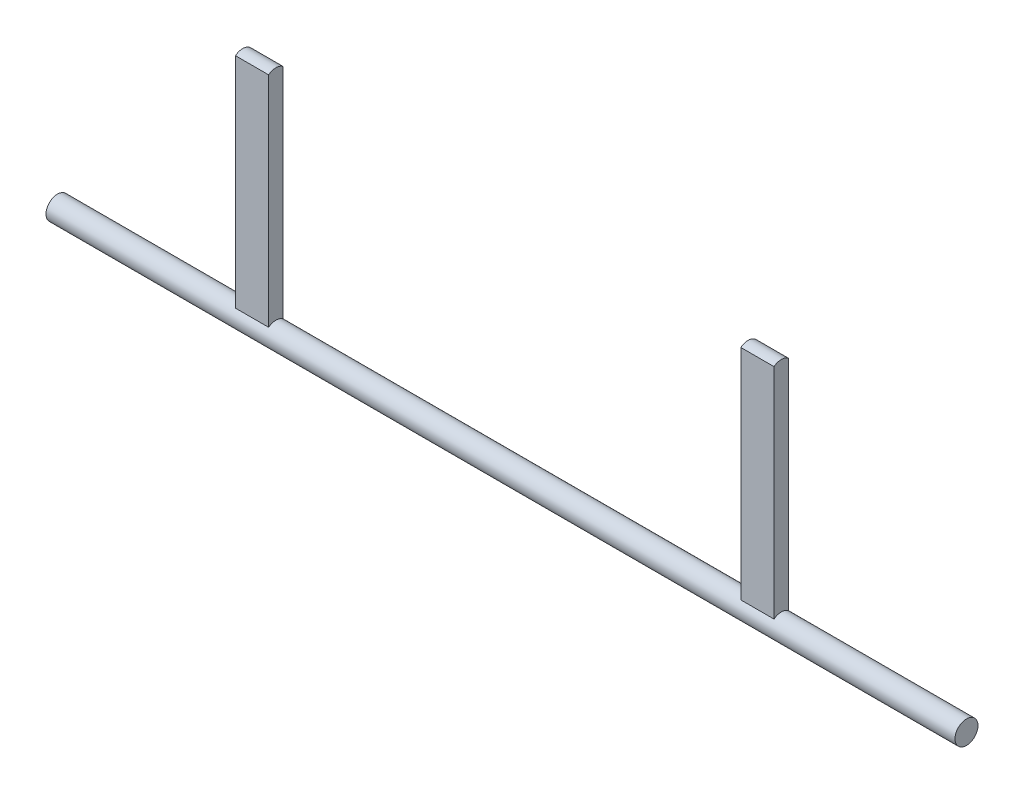
ISO-10303-21;
HEADER;
FILE_DESCRIPTION(('STEP AP214'),'2;1');
FILE_NAME('part.step','',(''),(''),'','','');
FILE_SCHEMA(('AUTOMOTIVE_DESIGN { 1 0 10303 214 1 1 1 1 }'));
ENDSEC;
DATA;
#1=APPLICATION_CONTEXT('core data for automotive mechanical design processes');
#2=APPLICATION_PROTOCOL_DEFINITION('international standard','automotive_design',2000,#1);
#3=PRODUCT_CONTEXT('',#1,'mechanical');
#4=PRODUCT('Part','Part','',(#3));
#5=PRODUCT_RELATED_PRODUCT_CATEGORY('part','',(#4));
#6=PRODUCT_DEFINITION_FORMATION('','',#4);
#7=PRODUCT_DEFINITION_CONTEXT('part definition',#1,'design');
#8=PRODUCT_DEFINITION('design','',#6,#7);
#9=PRODUCT_DEFINITION_SHAPE('','',#8);
#10=(LENGTH_UNIT() NAMED_UNIT(*) SI_UNIT(.MILLI.,.METRE.));
#11=(NAMED_UNIT(*) PLANE_ANGLE_UNIT() SI_UNIT($,.RADIAN.));
#12=(NAMED_UNIT(*) SI_UNIT($,.STERADIAN.) SOLID_ANGLE_UNIT());
#13=UNCERTAINTY_MEASURE_WITH_UNIT(LENGTH_MEASURE(1.E-05),#10,'distance_accuracy_value','');
#14=(GEOMETRIC_REPRESENTATION_CONTEXT(3) GLOBAL_UNCERTAINTY_ASSIGNED_CONTEXT((#13)) GLOBAL_UNIT_ASSIGNED_CONTEXT((#10,
#11,#12)) REPRESENTATION_CONTEXT('',''));
#15=CARTESIAN_POINT('',(0.,0.,0.));
#16=DIRECTION('',(0.,0.,1.));
#17=DIRECTION('',(1.,0.,0.));
#18=AXIS2_PLACEMENT_3D('',#15,#16,#17);
#19=CARTESIAN_POINT('',(270.121951219512,0.,0.));
#20=DIRECTION('',(1.,0.,0.));
#21=DIRECTION('',(0.,0.,-1.));
#22=AXIS2_PLACEMENT_3D('',#19,#20,#21);
#23=CYLINDRICAL_SURFACE('',#22,18.75);
#24=CARTESIAN_POINT('',(-740.,0.,0.));
#25=DIRECTION('',(1.,0.,0.));
#26=DIRECTION('',(0.,0.,-1.));
#27=AXIS2_PLACEMENT_3D('',#24,#25,#26);
#28=CIRCLE('',#27,18.75);
#29=CARTESIAN_POINT('',(-740.,0.,-18.75));
#30=VERTEX_POINT('',#29);
#31=EDGE_CURVE('E11',#30,#30,#28,.T.);
#32=ORIENTED_EDGE('',*,*,#31,.T.);
#33=EDGE_LOOP('',(#32));
#34=FACE_BOUND('',#33,.T.);
#35=CARTESIAN_POINT('',(740.,0.,0.));
#36=DIRECTION('',(1.,0.,0.));
#37=DIRECTION('',(0.,0.,-1.));
#38=AXIS2_PLACEMENT_3D('',#35,#36,#37);
#39=CIRCLE('',#38,18.75);
#40=CARTESIAN_POINT('',(740.,0.,-18.75));
#41=VERTEX_POINT('',#40);
#42=EDGE_CURVE('E43',#41,#41,#39,.T.);
#43=ORIENTED_EDGE('',*,*,#42,.F.);
#44=EDGE_LOOP('',(#43));
#45=FACE_BOUND('',#44,.T.);
#46=CARTESIAN_POINT('',(-438.446590398755,0.,0.));
#47=DIRECTION('',(1.,0.,0.));
#48=DIRECTION('',(0.,0.,-1.));
#49=AXIS2_PLACEMENT_3D('',#46,#47,#48);
#50=CIRCLE('',#49,18.75);
#51=CARTESIAN_POINT('',(-438.446590398755,14.5730438193042,-11.7978342860306));
#52=VERTEX_POINT('',#51);
#53=CARTESIAN_POINT('',(-438.446590398755,14.5730438193042,11.7978342860306));
#54=VERTEX_POINT('',#53);
#55=EDGE_CURVE('E125',#52,#54,#50,.T.);
#56=ORIENTED_EDGE('',*,*,#55,.F.);
#57=DIRECTION('',(1.,0.,0.));
#58=VECTOR('',#57,1.);
#59=CARTESIAN_POINT('',(270.121951219512,14.5730438193042,-11.7978342860306));
#60=LINE('',#59,#58);
#61=CARTESIAN_POINT('',(-384.42466696444,14.5730438193042,-11.7978342860306));
#62=VERTEX_POINT('',#61);
#63=EDGE_CURVE('E138',#52,#62,#60,.T.);
#64=ORIENTED_EDGE('',*,*,#63,.T.);
#65=CARTESIAN_POINT('',(-384.42466696444,0.,0.));
#66=DIRECTION('',(-1.,0.,0.));
#67=DIRECTION('',(0.,0.,1.));
#68=AXIS2_PLACEMENT_3D('',#65,#66,#67);
#69=CIRCLE('',#68,18.75);
#70=CARTESIAN_POINT('',(-384.42466696444,14.5730438193042,11.7978342860306));
#71=VERTEX_POINT('',#70);
#72=EDGE_CURVE('E133',#71,#62,#69,.T.);
#73=ORIENTED_EDGE('',*,*,#72,.F.);
#74=DIRECTION('',(1.,0.,0.));
#75=VECTOR('',#74,1.);
#76=CARTESIAN_POINT('',(270.121951219512,14.5730438193042,11.7978342860306));
#77=LINE('',#76,#75);
#78=EDGE_CURVE('E129',#54,#71,#77,.T.);
#79=ORIENTED_EDGE('',*,*,#78,.F.);
#80=EDGE_LOOP('',(#56,#64,#73,#79));
#81=FACE_BOUND('',#80,.T.);
#82=CARTESIAN_POINT('',(384.42466696444,0.,0.));
#83=DIRECTION('',(-1.,0.,0.));
#84=DIRECTION('',(0.,0.,1.));
#85=AXIS2_PLACEMENT_3D('',#82,#83,#84);
#86=CIRCLE('',#85,18.75);
#87=CARTESIAN_POINT('',(384.42466696444,14.5730438193042,11.7978342860306));
#88=VERTEX_POINT('',#87);
#89=CARTESIAN_POINT('',(384.42466696444,14.5730438193042,-11.7978342860306));
#90=VERTEX_POINT('',#89);
#91=EDGE_CURVE('E50',#88,#90,#86,.T.);
#92=ORIENTED_EDGE('',*,*,#91,.T.);
#93=DIRECTION('',(1.,0.,0.));
#94=VECTOR('',#93,1.);
#95=CARTESIAN_POINT('',(270.121951219512,14.5730438193042,-11.7978342860306));
#96=LINE('',#95,#94);
#97=CARTESIAN_POINT('',(438.446590398755,14.5730438193042,-11.7978342860306));
#98=VERTEX_POINT('',#97);
#99=EDGE_CURVE('E54',#90,#98,#96,.T.);
#100=ORIENTED_EDGE('',*,*,#99,.T.);
#101=CARTESIAN_POINT('',(438.446590398755,0.,0.));
#102=DIRECTION('',(1.,0.,0.));
#103=DIRECTION('',(0.,0.,-1.));
#104=AXIS2_PLACEMENT_3D('',#101,#102,#103);
#105=CIRCLE('',#104,18.75);
#106=CARTESIAN_POINT('',(438.446590398755,14.5730438193042,11.7978342860306));
#107=VERTEX_POINT('',#106);
#108=EDGE_CURVE('E95',#98,#107,#105,.T.);
#109=ORIENTED_EDGE('',*,*,#108,.T.);
#110=DIRECTION('',(1.,0.,0.));
#111=VECTOR('',#110,1.);
#112=CARTESIAN_POINT('',(270.121951219512,14.5730438193042,11.7978342860306));
#113=LINE('',#112,#111);
#114=EDGE_CURVE('E97',#88,#107,#113,.T.);
#115=ORIENTED_EDGE('',*,*,#114,.F.);
#116=EDGE_LOOP('',(#92,#100,#109,#115));
#117=FACE_BOUND('',#116,.T.);
#118=ADVANCED_FACE('F35',(#34,#45,#81,#117),#23,.T.);
#119=CARTESIAN_POINT('',(-740.,0.,0.));
#120=DIRECTION('',(-1.,0.,0.));
#121=DIRECTION('',(0.,0.,1.));
#122=AXIS2_PLACEMENT_3D('',#119,#120,#121);
#123=PLANE('',#122);
#124=ORIENTED_EDGE('',*,*,#31,.F.);
#125=EDGE_LOOP('',(#124));
#126=FACE_BOUND('',#125,.T.);
#127=ADVANCED_FACE('F37',(#126),#123,.T.);
#128=CARTESIAN_POINT('',(740.,0.,-18.75));
#129=DIRECTION('',(1.,0.,0.));
#130=DIRECTION('',(0.,0.,-1.));
#131=AXIS2_PLACEMENT_3D('',#128,#129,#130);
#132=PLANE('',#131);
#133=ORIENTED_EDGE('',*,*,#42,.T.);
#134=EDGE_LOOP('',(#133));
#135=FACE_BOUND('',#134,.T.);
#136=ADVANCED_FACE('F160',(#135),#132,.T.);
#137=CARTESIAN_POINT('',(270.121951219512,356.,0.));
#138=DIRECTION('',(1.,0.,0.));
#139=DIRECTION('',(0.,0.,-1.));
#140=AXIS2_PLACEMENT_3D('',#137,#138,#139);
#141=CYLINDRICAL_SURFACE('',#140,18.75);
#142=DIRECTION('',(1.,0.,0.));
#143=VECTOR('',#142,1.);
#144=CARTESIAN_POINT('',(270.121951219512,370.573043819304,-11.7978342860306));
#145=LINE('',#144,#143);
#146=CARTESIAN_POINT('',(-438.446590398755,370.573043819304,-11.7978342860306));
#147=VERTEX_POINT('',#146);
#148=CARTESIAN_POINT('',(-384.42466696444,370.573043819304,-11.7978342860306));
#149=VERTEX_POINT('',#148);
#150=EDGE_CURVE('E102',#147,#149,#145,.T.);
#151=ORIENTED_EDGE('',*,*,#150,.F.);
#152=CARTESIAN_POINT('',(-438.446590398755,356.,0.));
#153=DIRECTION('',(1.,0.,0.));
#154=DIRECTION('',(0.,0.,-1.));
#155=AXIS2_PLACEMENT_3D('',#152,#153,#154);
#156=CIRCLE('',#155,18.75);
#157=CARTESIAN_POINT('',(-438.446590398755,370.573043819304,11.7978342860306));
#158=VERTEX_POINT('',#157);
#159=EDGE_CURVE('E128',#147,#158,#156,.T.);
#160=ORIENTED_EDGE('',*,*,#159,.T.);
#161=DIRECTION('',(1.,0.,0.));
#162=VECTOR('',#161,1.);
#163=CARTESIAN_POINT('',(270.121951219512,370.573043819304,11.7978342860306));
#164=LINE('',#163,#162);
#165=CARTESIAN_POINT('',(-384.42466696444,370.573043819304,11.7978342860306));
#166=VERTEX_POINT('',#165);
#167=EDGE_CURVE('E136',#158,#166,#164,.T.);
#168=ORIENTED_EDGE('',*,*,#167,.T.);
#169=CARTESIAN_POINT('',(-384.42466696444,356.,0.));
#170=DIRECTION('',(-1.,0.,0.));
#171=DIRECTION('',(0.,0.,1.));
#172=AXIS2_PLACEMENT_3D('',#169,#170,#171);
#173=CIRCLE('',#172,18.75);
#174=EDGE_CURVE('E146',#166,#149,#173,.T.);
#175=ORIENTED_EDGE('',*,*,#174,.T.);
#176=EDGE_LOOP('',(#151,#160,#168,#175));
#177=FACE_BOUND('',#176,.T.);
#178=ADVANCED_FACE('F175',(#177),#141,.T.);
#179=CARTESIAN_POINT('',(270.121951219512,14.5730438193042,-11.7978342860306));
#180=DIRECTION('',(0.,0.,1.));
#181=DIRECTION('',(1.,0.,0.));
#182=AXIS2_PLACEMENT_3D('',#179,#180,#181);
#183=PLANE('',#182);
#184=ORIENTED_EDGE('',*,*,#150,.T.);
#185=DIRECTION('',(0.,1.,0.));
#186=VECTOR('',#185,1.);
#187=CARTESIAN_POINT('',(-384.42466696444,14.5730438193042,-11.7978342860306));
#188=LINE('',#187,#186);
#189=EDGE_CURVE('E140',#62,#149,#188,.T.);
#190=ORIENTED_EDGE('',*,*,#189,.F.);
#191=ORIENTED_EDGE('',*,*,#63,.F.);
#192=DIRECTION('',(0.,1.,0.));
#193=VECTOR('',#192,1.);
#194=CARTESIAN_POINT('',(-438.446590398755,14.5730438193042,-11.7978342860306));
#195=LINE('',#194,#193);
#196=EDGE_CURVE('E141',#52,#147,#195,.T.);
#197=ORIENTED_EDGE('',*,*,#196,.T.);
#198=EDGE_LOOP('',(#184,#190,#191,#197));
#199=FACE_BOUND('',#198,.T.);
#200=ADVANCED_FACE('F171',(#199),#183,.F.);
#201=CARTESIAN_POINT('',(-438.446590398755,14.5730438193042,11.7978342860306));
#202=DIRECTION('',(-1.,0.,0.));
#203=DIRECTION('',(0.,0.,1.));
#204=AXIS2_PLACEMENT_3D('',#201,#202,#203);
#205=PLANE('',#204);
#206=ORIENTED_EDGE('',*,*,#159,.F.);
#207=ORIENTED_EDGE('',*,*,#196,.F.);
#208=ORIENTED_EDGE('',*,*,#55,.T.);
#209=DIRECTION('',(0.,1.,0.));
#210=VECTOR('',#209,1.);
#211=CARTESIAN_POINT('',(-438.446590398755,14.5730438193042,11.7978342860306));
#212=LINE('',#211,#210);
#213=EDGE_CURVE('E132',#54,#158,#212,.T.);
#214=ORIENTED_EDGE('',*,*,#213,.T.);
#215=EDGE_LOOP('',(#206,#207,#208,#214));
#216=FACE_BOUND('',#215,.T.);
#217=ADVANCED_FACE('F173',(#216),#205,.T.);
#218=CARTESIAN_POINT('',(270.121951219512,14.5730438193042,11.7978342860306));
#219=DIRECTION('',(0.,0.,1.));
#220=DIRECTION('',(1.,0.,0.));
#221=AXIS2_PLACEMENT_3D('',#218,#219,#220);
#222=PLANE('',#221);
#223=ORIENTED_EDGE('',*,*,#167,.F.);
#224=ORIENTED_EDGE('',*,*,#213,.F.);
#225=ORIENTED_EDGE('',*,*,#78,.T.);
#226=DIRECTION('',(0.,1.,0.));
#227=VECTOR('',#226,1.);
#228=CARTESIAN_POINT('',(-384.42466696444,14.5730438193042,11.7978342860306));
#229=LINE('',#228,#227);
#230=EDGE_CURVE('E137',#71,#166,#229,.T.);
#231=ORIENTED_EDGE('',*,*,#230,.T.);
#232=EDGE_LOOP('',(#223,#224,#225,#231));
#233=FACE_BOUND('',#232,.T.);
#234=ADVANCED_FACE('F180',(#233),#222,.T.);
#235=CARTESIAN_POINT('',(-384.42466696444,14.5730438193042,-11.7978342860306));
#236=DIRECTION('',(1.,0.,0.));
#237=DIRECTION('',(0.,0.,-1.));
#238=AXIS2_PLACEMENT_3D('',#235,#236,#237);
#239=PLANE('',#238);
#240=ORIENTED_EDGE('',*,*,#174,.F.);
#241=ORIENTED_EDGE('',*,*,#230,.F.);
#242=ORIENTED_EDGE('',*,*,#72,.T.);
#243=ORIENTED_EDGE('',*,*,#189,.T.);
#244=EDGE_LOOP('',(#240,#241,#242,#243));
#245=FACE_BOUND('',#244,.T.);
#246=ADVANCED_FACE('F177',(#245),#239,.T.);
#247=CARTESIAN_POINT('',(270.121951219512,356.,0.));
#248=DIRECTION('',(1.,0.,0.));
#249=DIRECTION('',(0.,0.,-1.));
#250=AXIS2_PLACEMENT_3D('',#247,#248,#249);
#251=CYLINDRICAL_SURFACE('',#250,18.75);
#252=CARTESIAN_POINT('',(438.446590398755,356.,0.));
#253=DIRECTION('',(1.,0.,0.));
#254=DIRECTION('',(0.,0.,-1.));
#255=AXIS2_PLACEMENT_3D('',#252,#253,#254);
#256=CIRCLE('',#255,18.75);
#257=CARTESIAN_POINT('',(438.446590398755,370.573043819304,-11.7978342860306));
#258=VERTEX_POINT('',#257);
#259=CARTESIAN_POINT('',(438.446590398755,370.573043819304,11.7978342860306));
#260=VERTEX_POINT('',#259);
#261=EDGE_CURVE('E103',#258,#260,#256,.T.);
#262=ORIENTED_EDGE('',*,*,#261,.F.);
#263=DIRECTION('',(1.,0.,0.));
#264=VECTOR('',#263,1.);
#265=CARTESIAN_POINT('',(270.121951219512,370.573043819304,-11.7978342860306));
#266=LINE('',#265,#264);
#267=CARTESIAN_POINT('',(384.42466696444,370.573043819304,-11.7978342860306));
#268=VERTEX_POINT('',#267);
#269=EDGE_CURVE('E295',#268,#258,#266,.T.);
#270=ORIENTED_EDGE('',*,*,#269,.F.);
#271=CARTESIAN_POINT('',(384.42466696444,356.,0.));
#272=DIRECTION('',(-1.,0.,0.));
#273=DIRECTION('',(0.,0.,1.));
#274=AXIS2_PLACEMENT_3D('',#271,#272,#273);
#275=CIRCLE('',#274,18.75);
#276=CARTESIAN_POINT('',(384.42466696444,370.573043819304,11.7978342860306));
#277=VERTEX_POINT('',#276);
#278=EDGE_CURVE('E124',#277,#268,#275,.T.);
#279=ORIENTED_EDGE('',*,*,#278,.F.);
#280=DIRECTION('',(1.,0.,0.));
#281=VECTOR('',#280,1.);
#282=CARTESIAN_POINT('',(270.121951219512,370.573043819304,11.7978342860306));
#283=LINE('',#282,#281);
#284=EDGE_CURVE('E113',#277,#260,#283,.T.);
#285=ORIENTED_EDGE('',*,*,#284,.T.);
#286=EDGE_LOOP('',(#262,#270,#279,#285));
#287=FACE_BOUND('',#286,.T.);
#288=ADVANCED_FACE('F187',(#287),#251,.T.);
#289=CARTESIAN_POINT('',(270.121951219512,14.5730438193042,-11.7978342860306));
#290=DIRECTION('',(0.,0.,1.));
#291=DIRECTION('',(1.,0.,0.));
#292=AXIS2_PLACEMENT_3D('',#289,#290,#291);
#293=PLANE('',#292);
#294=ORIENTED_EDGE('',*,*,#269,.T.);
#295=DIRECTION('',(0.,1.,0.));
#296=VECTOR('',#295,1.);
#297=CARTESIAN_POINT('',(438.446590398755,14.5730438193042,-11.7978342860306));
#298=LINE('',#297,#296);
#299=EDGE_CURVE('E122',#98,#258,#298,.T.);
#300=ORIENTED_EDGE('',*,*,#299,.F.);
#301=ORIENTED_EDGE('',*,*,#99,.F.);
#302=DIRECTION('',(0.,1.,0.));
#303=VECTOR('',#302,1.);
#304=CARTESIAN_POINT('',(384.42466696444,14.5730438193042,-11.7978342860306));
#305=LINE('',#304,#303);
#306=EDGE_CURVE('E292',#90,#268,#305,.T.);
#307=ORIENTED_EDGE('',*,*,#306,.T.);
#308=EDGE_LOOP('',(#294,#300,#301,#307));
#309=FACE_BOUND('',#308,.T.);
#310=ADVANCED_FACE('F218',(#309),#293,.F.);
#311=CARTESIAN_POINT('',(384.42466696444,14.5730438193042,-11.7978342860306));
#312=DIRECTION('',(1.,0.,0.));
#313=DIRECTION('',(0.,0.,-1.));
#314=AXIS2_PLACEMENT_3D('',#311,#312,#313);
#315=PLANE('',#314);
#316=ORIENTED_EDGE('',*,*,#278,.T.);
#317=ORIENTED_EDGE('',*,*,#306,.F.);
#318=ORIENTED_EDGE('',*,*,#91,.F.);
#319=DIRECTION('',(0.,1.,0.));
#320=VECTOR('',#319,1.);
#321=CARTESIAN_POINT('',(384.42466696444,14.5730438193042,11.7978342860306));
#322=LINE('',#321,#320);
#323=EDGE_CURVE('E112',#88,#277,#322,.T.);
#324=ORIENTED_EDGE('',*,*,#323,.T.);
#325=EDGE_LOOP('',(#316,#317,#318,#324));
#326=FACE_BOUND('',#325,.T.);
#327=ADVANCED_FACE('F228',(#326),#315,.F.);
#328=CARTESIAN_POINT('',(438.446590398755,14.5730438193042,11.7978342860306));
#329=DIRECTION('',(-1.,0.,0.));
#330=DIRECTION('',(0.,0.,1.));
#331=AXIS2_PLACEMENT_3D('',#328,#329,#330);
#332=PLANE('',#331);
#333=ORIENTED_EDGE('',*,*,#261,.T.);
#334=DIRECTION('',(0.,1.,0.));
#335=VECTOR('',#334,1.);
#336=CARTESIAN_POINT('',(438.446590398755,14.5730438193042,11.7978342860306));
#337=LINE('',#336,#335);
#338=EDGE_CURVE('E109',#107,#260,#337,.T.);
#339=ORIENTED_EDGE('',*,*,#338,.F.);
#340=ORIENTED_EDGE('',*,*,#108,.F.);
#341=ORIENTED_EDGE('',*,*,#299,.T.);
#342=EDGE_LOOP('',(#333,#339,#340,#341));
#343=FACE_BOUND('',#342,.T.);
#344=ADVANCED_FACE('F115',(#343),#332,.F.);
#345=CARTESIAN_POINT('',(270.121951219512,14.5730438193042,11.7978342860306));
#346=DIRECTION('',(0.,0.,1.));
#347=DIRECTION('',(1.,0.,0.));
#348=AXIS2_PLACEMENT_3D('',#345,#346,#347);
#349=PLANE('',#348);
#350=ORIENTED_EDGE('',*,*,#284,.F.);
#351=ORIENTED_EDGE('',*,*,#323,.F.);
#352=ORIENTED_EDGE('',*,*,#114,.T.);
#353=ORIENTED_EDGE('',*,*,#338,.T.);
#354=EDGE_LOOP('',(#350,#351,#352,#353));
#355=FACE_BOUND('',#354,.T.);
#356=ADVANCED_FACE('F108',(#355),#349,.T.);
#357=CLOSED_SHELL('',(#118,#127,#136,#178,#200,#217,#234,#246,#288,#310,#327,#344,#356));
#358=MANIFOLD_SOLID_BREP('B2',#357);
#359=ADVANCED_BREP_SHAPE_REPRESENTATION('',(#18,#358),#14);
#360=SHAPE_DEFINITION_REPRESENTATION(#9,#359);
ENDSEC;
END-ISO-10303-21;
